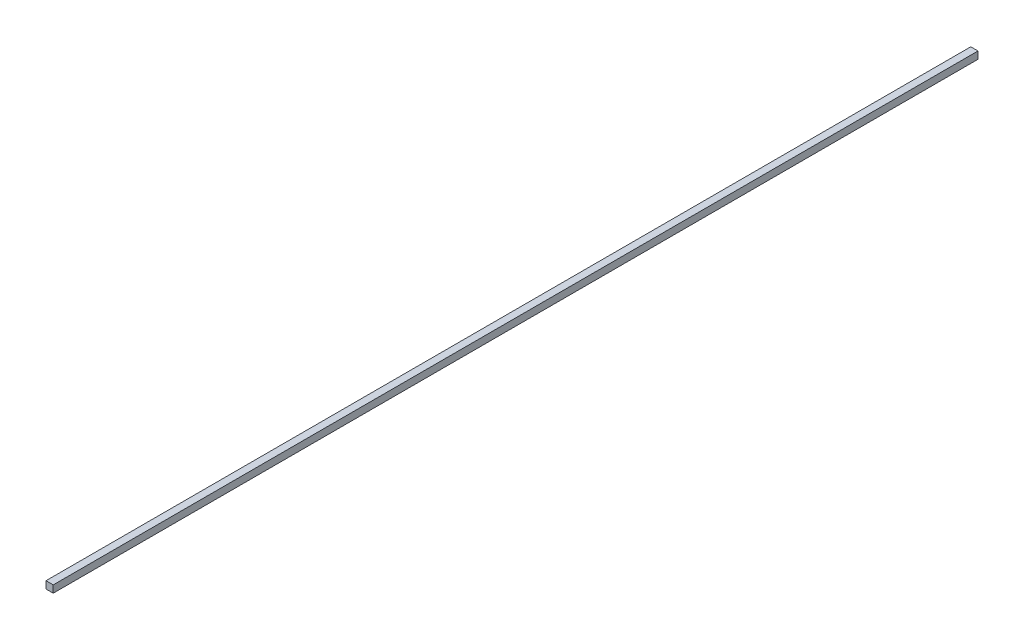
ISO-10303-21;
HEADER;
FILE_DESCRIPTION(('STEP AP214'),'2;1');
FILE_NAME('part.step','',(''),(''),'','','');
FILE_SCHEMA(('AUTOMOTIVE_DESIGN { 1 0 10303 214 1 1 1 1 }'));
ENDSEC;
DATA;
#1=APPLICATION_CONTEXT('core data for automotive mechanical design processes');
#2=APPLICATION_PROTOCOL_DEFINITION('international standard','automotive_design',2000,#1);
#3=PRODUCT_CONTEXT('',#1,'mechanical');
#4=PRODUCT('Part','Part','',(#3));
#5=PRODUCT_RELATED_PRODUCT_CATEGORY('part','',(#4));
#6=PRODUCT_DEFINITION_FORMATION('','',#4);
#7=PRODUCT_DEFINITION_CONTEXT('part definition',#1,'design');
#8=PRODUCT_DEFINITION('design','',#6,#7);
#9=PRODUCT_DEFINITION_SHAPE('','',#8);
#10=(LENGTH_UNIT() NAMED_UNIT(*) SI_UNIT(.MILLI.,.METRE.));
#11=(NAMED_UNIT(*) PLANE_ANGLE_UNIT() SI_UNIT($,.RADIAN.));
#12=(NAMED_UNIT(*) SI_UNIT($,.STERADIAN.) SOLID_ANGLE_UNIT());
#13=UNCERTAINTY_MEASURE_WITH_UNIT(LENGTH_MEASURE(1.E-05),#10,'distance_accuracy_value','');
#14=(GEOMETRIC_REPRESENTATION_CONTEXT(3) GLOBAL_UNCERTAINTY_ASSIGNED_CONTEXT((#13)) GLOBAL_UNIT_ASSIGNED_CONTEXT((#10,
#11,#12)) REPRESENTATION_CONTEXT('',''));
#15=CARTESIAN_POINT('',(0.,0.,0.));
#16=DIRECTION('',(0.,0.,1.));
#17=DIRECTION('',(1.,0.,0.));
#18=AXIS2_PLACEMENT_3D('',#15,#16,#17);
#19=CARTESIAN_POINT('',(-1.190625,-1.190625,152.4));
#20=DIRECTION('',(1.,0.,0.));
#21=DIRECTION('',(0.,1.,0.));
#22=AXIS2_PLACEMENT_3D('',#19,#20,#21);
#23=PLANE('',#22);
#24=DIRECTION('',(0.,0.,-1.));
#25=VECTOR('',#24,1.);
#26=CARTESIAN_POINT('',(-1.190625,1.190625,152.4));
#27=LINE('',#26,#25);
#28=CARTESIAN_POINT('',(-1.190625,1.190625,152.4));
#29=VERTEX_POINT('',#28);
#30=CARTESIAN_POINT('',(-1.190625,1.190625,-152.4));
#31=VERTEX_POINT('',#30);
#32=EDGE_CURVE('E92',#29,#31,#27,.T.);
#33=ORIENTED_EDGE('',*,*,#32,.T.);
#34=DIRECTION('',(0.,-1.,0.));
#35=VECTOR('',#34,1.);
#36=CARTESIAN_POINT('',(-1.190625,-1.190625,-152.4));
#37=LINE('',#36,#35);
#38=CARTESIAN_POINT('',(-1.190625,-1.190625,-152.4));
#39=VERTEX_POINT('',#38);
#40=EDGE_CURVE('E87',#31,#39,#37,.T.);
#41=ORIENTED_EDGE('',*,*,#40,.T.);
#42=DIRECTION('',(0.,0.,-1.));
#43=VECTOR('',#42,1.);
#44=CARTESIAN_POINT('',(-1.190625,-1.190625,152.4));
#45=LINE('',#44,#43);
#46=CARTESIAN_POINT('',(-1.190625,-1.190625,152.4));
#47=VERTEX_POINT('',#46);
#48=EDGE_CURVE('E11',#47,#39,#45,.T.);
#49=ORIENTED_EDGE('',*,*,#48,.F.);
#50=DIRECTION('',(0.,-1.,0.));
#51=VECTOR('',#50,1.);
#52=CARTESIAN_POINT('',(-1.190625,-1.190625,152.4));
#53=LINE('',#52,#51);
#54=EDGE_CURVE('E98',#29,#47,#53,.T.);
#55=ORIENTED_EDGE('',*,*,#54,.F.);
#56=EDGE_LOOP('',(#33,#41,#49,#55));
#57=FACE_BOUND('',#56,.T.);
#58=ADVANCED_FACE('F35',(#57),#23,.F.);
#59=CARTESIAN_POINT('',(1.190625,-1.190625,152.4));
#60=DIRECTION('',(0.,1.,0.));
#61=DIRECTION('',(0.,0.,1.));
#62=AXIS2_PLACEMENT_3D('',#59,#60,#61);
#63=PLANE('',#62);
#64=ORIENTED_EDGE('',*,*,#48,.T.);
#65=DIRECTION('',(1.,0.,0.));
#66=VECTOR('',#65,1.);
#67=CARTESIAN_POINT('',(1.190625,-1.190625,-152.4));
#68=LINE('',#67,#66);
#69=CARTESIAN_POINT('',(1.190625,-1.190625,-152.4));
#70=VERTEX_POINT('',#69);
#71=EDGE_CURVE('E77',#39,#70,#68,.T.);
#72=ORIENTED_EDGE('',*,*,#71,.T.);
#73=DIRECTION('',(0.,0.,-1.));
#74=VECTOR('',#73,1.);
#75=CARTESIAN_POINT('',(1.190625,-1.190625,152.4));
#76=LINE('',#75,#74);
#77=CARTESIAN_POINT('',(1.190625,-1.190625,152.4));
#78=VERTEX_POINT('',#77);
#79=EDGE_CURVE('E42',#78,#70,#76,.T.);
#80=ORIENTED_EDGE('',*,*,#79,.F.);
#81=DIRECTION('',(1.,0.,0.));
#82=VECTOR('',#81,1.);
#83=CARTESIAN_POINT('',(1.190625,-1.190625,152.4));
#84=LINE('',#83,#82);
#85=EDGE_CURVE('E78',#47,#78,#84,.T.);
#86=ORIENTED_EDGE('',*,*,#85,.F.);
#87=EDGE_LOOP('',(#64,#72,#80,#86));
#88=FACE_BOUND('',#87,.T.);
#89=ADVANCED_FACE('F75',(#88),#63,.F.);
#90=CARTESIAN_POINT('',(1.190625,1.190625,152.4));
#91=DIRECTION('',(-1.,0.,0.));
#92=DIRECTION('',(0.,-1.,0.));
#93=AXIS2_PLACEMENT_3D('',#90,#91,#92);
#94=PLANE('',#93);
#95=ORIENTED_EDGE('',*,*,#79,.T.);
#96=DIRECTION('',(0.,1.,0.));
#97=VECTOR('',#96,1.);
#98=CARTESIAN_POINT('',(1.190625,1.190625,-152.4));
#99=LINE('',#98,#97);
#100=CARTESIAN_POINT('',(1.190625,1.190625,-152.4));
#101=VERTEX_POINT('',#100);
#102=EDGE_CURVE('E90',#70,#101,#99,.T.);
#103=ORIENTED_EDGE('',*,*,#102,.T.);
#104=DIRECTION('',(0.,0.,-1.));
#105=VECTOR('',#104,1.);
#106=CARTESIAN_POINT('',(1.190625,1.190625,152.4));
#107=LINE('',#106,#105);
#108=CARTESIAN_POINT('',(1.190625,1.190625,152.4));
#109=VERTEX_POINT('',#108);
#110=EDGE_CURVE('E104',#109,#101,#107,.T.);
#111=ORIENTED_EDGE('',*,*,#110,.F.);
#112=DIRECTION('',(0.,1.,0.));
#113=VECTOR('',#112,1.);
#114=CARTESIAN_POINT('',(1.190625,1.190625,152.4));
#115=LINE('',#114,#113);
#116=EDGE_CURVE('E54',#78,#109,#115,.T.);
#117=ORIENTED_EDGE('',*,*,#116,.F.);
#118=EDGE_LOOP('',(#95,#103,#111,#117));
#119=FACE_BOUND('',#118,.T.);
#120=ADVANCED_FACE('F106',(#119),#94,.F.);
#121=CARTESIAN_POINT('',(-1.190625,1.190625,152.4));
#122=DIRECTION('',(0.,-1.,0.));
#123=DIRECTION('',(0.,0.,-1.));
#124=AXIS2_PLACEMENT_3D('',#121,#122,#123);
#125=PLANE('',#124);
#126=ORIENTED_EDGE('',*,*,#110,.T.);
#127=DIRECTION('',(-1.,0.,0.));
#128=VECTOR('',#127,1.);
#129=CARTESIAN_POINT('',(-1.190625,1.190625,-152.4));
#130=LINE('',#129,#128);
#131=EDGE_CURVE('E96',#101,#31,#130,.T.);
#132=ORIENTED_EDGE('',*,*,#131,.T.);
#133=ORIENTED_EDGE('',*,*,#32,.F.);
#134=DIRECTION('',(-1.,0.,0.));
#135=VECTOR('',#134,1.);
#136=CARTESIAN_POINT('',(-1.190625,1.190625,152.4));
#137=LINE('',#136,#135);
#138=EDGE_CURVE('E49',#109,#29,#137,.T.);
#139=ORIENTED_EDGE('',*,*,#138,.F.);
#140=EDGE_LOOP('',(#126,#132,#133,#139));
#141=FACE_BOUND('',#140,.T.);
#142=ADVANCED_FACE('F108',(#141),#125,.F.);
#143=CARTESIAN_POINT('',(0.,0.,152.4));
#144=DIRECTION('',(0.,0.,-1.));
#145=DIRECTION('',(-1.,0.,0.));
#146=AXIS2_PLACEMENT_3D('',#143,#144,#145);
#147=PLANE('',#146);
#148=ORIENTED_EDGE('',*,*,#54,.T.);
#149=ORIENTED_EDGE('',*,*,#85,.T.);
#150=ORIENTED_EDGE('',*,*,#116,.T.);
#151=ORIENTED_EDGE('',*,*,#138,.T.);
#152=EDGE_LOOP('',(#148,#149,#150,#151));
#153=FACE_BOUND('',#152,.T.);
#154=ADVANCED_FACE('F109',(#153),#147,.F.);
#155=CARTESIAN_POINT('',(0.,0.,-152.4));
#156=DIRECTION('',(0.,0.,-1.));
#157=DIRECTION('',(-1.,0.,0.));
#158=AXIS2_PLACEMENT_3D('',#155,#156,#157);
#159=PLANE('',#158);
#160=ORIENTED_EDGE('',*,*,#40,.F.);
#161=ORIENTED_EDGE('',*,*,#131,.F.);
#162=ORIENTED_EDGE('',*,*,#102,.F.);
#163=ORIENTED_EDGE('',*,*,#71,.F.);
#164=EDGE_LOOP('',(#160,#161,#162,#163));
#165=FACE_BOUND('',#164,.T.);
#166=ADVANCED_FACE('F85',(#165),#159,.T.);
#167=CLOSED_SHELL('',(#58,#89,#120,#142,#154,#166));
#168=MANIFOLD_SOLID_BREP('B2',#167);
#169=ADVANCED_BREP_SHAPE_REPRESENTATION('',(#18,#168),#14);
#170=SHAPE_DEFINITION_REPRESENTATION(#9,#169);
ENDSEC;
END-ISO-10303-21;
